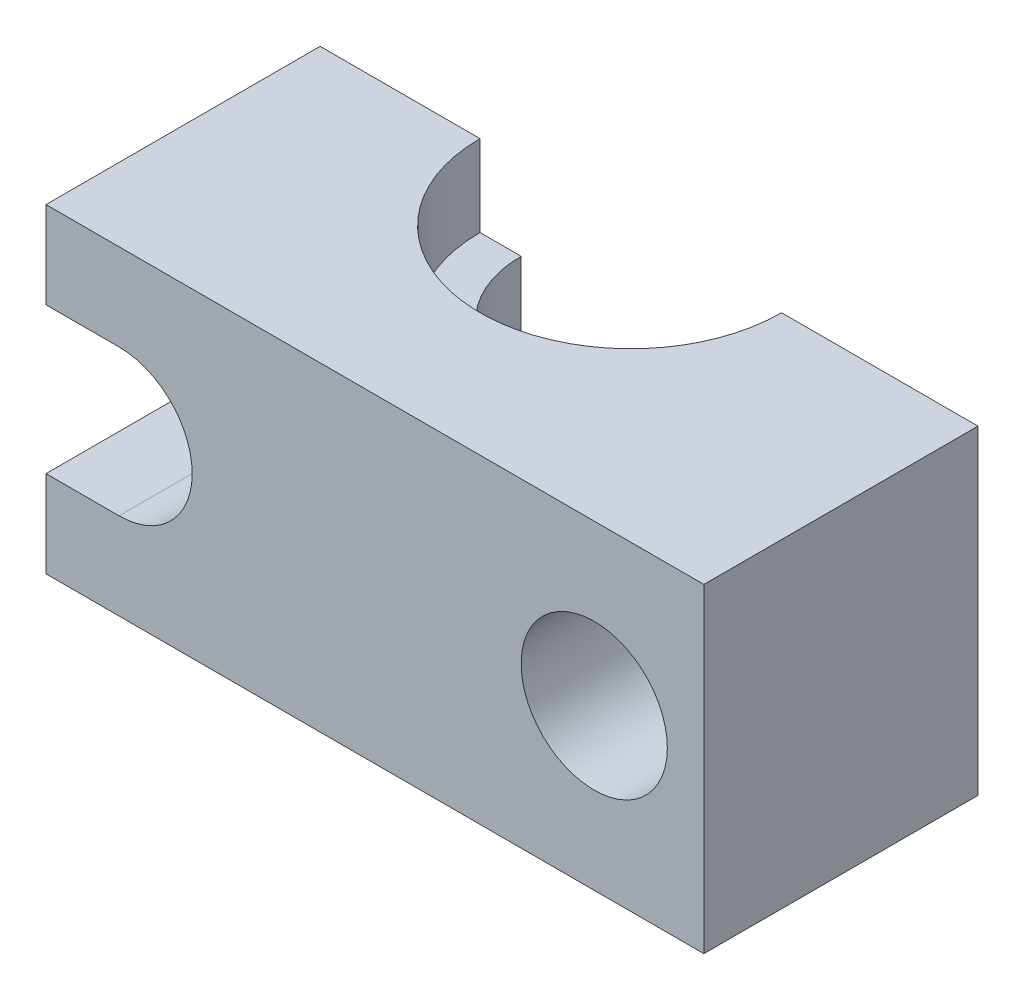
ISO-10303-21;
HEADER;
FILE_DESCRIPTION(('STEP AP214'),'2;1');
FILE_NAME('part.step','',(''),(''),'','','');
FILE_SCHEMA(('AUTOMOTIVE_DESIGN { 1 0 10303 214 1 1 1 1 }'));
ENDSEC;
DATA;
#1=APPLICATION_CONTEXT('core data for automotive mechanical design processes');
#2=APPLICATION_PROTOCOL_DEFINITION('international standard','automotive_design',2000,#1);
#3=PRODUCT_CONTEXT('',#1,'mechanical');
#4=PRODUCT('Part','Part','',(#3));
#5=PRODUCT_RELATED_PRODUCT_CATEGORY('part','',(#4));
#6=PRODUCT_DEFINITION_FORMATION('','',#4);
#7=PRODUCT_DEFINITION_CONTEXT('part definition',#1,'design');
#8=PRODUCT_DEFINITION('design','',#6,#7);
#9=PRODUCT_DEFINITION_SHAPE('','',#8);
#10=(LENGTH_UNIT() NAMED_UNIT(*) SI_UNIT(.MILLI.,.METRE.));
#11=(NAMED_UNIT(*) PLANE_ANGLE_UNIT() SI_UNIT($,.RADIAN.));
#12=(NAMED_UNIT(*) SI_UNIT($,.STERADIAN.) SOLID_ANGLE_UNIT());
#13=UNCERTAINTY_MEASURE_WITH_UNIT(LENGTH_MEASURE(1.E-05),#10,'distance_accuracy_value','');
#14=(GEOMETRIC_REPRESENTATION_CONTEXT(3) GLOBAL_UNCERTAINTY_ASSIGNED_CONTEXT((#13)) GLOBAL_UNIT_ASSIGNED_CONTEXT((#10,
#11,#12)) REPRESENTATION_CONTEXT('',''));
#15=CARTESIAN_POINT('',(0.,0.,0.));
#16=DIRECTION('',(0.,0.,1.));
#17=DIRECTION('',(1.,0.,0.));
#18=AXIS2_PLACEMENT_3D('',#15,#16,#17);
#19=CARTESIAN_POINT('',(0.,0.,0.));
#20=DIRECTION('',(0.,0.,1.));
#21=DIRECTION('',(1.,0.,0.));
#22=AXIS2_PLACEMENT_3D('',#19,#20,#21);
#23=PLANE('',#22);
#24=CARTESIAN_POINT('',(24.8485223656406,25.293010486401,0.));
#25=DIRECTION('',(0.,0.,1.));
#26=DIRECTION('',(1.,0.,0.));
#27=AXIS2_PLACEMENT_3D('',#24,#25,#26);
#28=CIRCLE('',#27,1.75);
#29=CARTESIAN_POINT('',(26.5985223656406,25.293010486401,0.));
#30=VERTEX_POINT('',#29);
#31=EDGE_CURVE('E193',#30,#30,#28,.F.);
#32=ORIENTED_EDGE('',*,*,#31,.F.);
#33=EDGE_LOOP('',(#32));
#34=FACE_BOUND('',#33,.T.);
#35=DIRECTION('',(-1.,0.,0.));
#36=VECTOR('',#35,1.);
#37=CARTESIAN_POINT('',(20.8485223656406,34.043010486401,0.));
#38=LINE('',#37,#36);
#39=CARTESIAN_POINT('',(29.5985223656406,34.043010486401,0.));
#40=VERTEX_POINT('',#39);
#41=CARTESIAN_POINT('',(20.8485223656406,34.043010486401,0.));
#42=VERTEX_POINT('',#41);
#43=EDGE_CURVE('E209',#40,#42,#38,.T.);
#44=ORIENTED_EDGE('',*,*,#43,.F.);
#45=DIRECTION('',(0.,-1.,0.));
#46=VECTOR('',#45,1.);
#47=CARTESIAN_POINT('',(29.5985223656406,16.543010486401,0.));
#48=LINE('',#47,#46);
#49=CARTESIAN_POINT('',(29.5985223656406,29.593010486401,0.));
#50=VERTEX_POINT('',#49);
#51=EDGE_CURVE('E12',#40,#50,#48,.T.);
#52=ORIENTED_EDGE('',*,*,#51,.T.);
#53=DIRECTION('',(1.,0.,0.));
#54=VECTOR('',#53,1.);
#55=CARTESIAN_POINT('',(0.,29.593010486401,0.));
#56=LINE('',#55,#54);
#57=CARTESIAN_POINT('',(31.8485223656406,29.593010486401,0.));
#58=VERTEX_POINT('',#57);
#59=EDGE_CURVE('E43',#50,#58,#56,.T.);
#60=ORIENTED_EDGE('',*,*,#59,.T.);
#61=DIRECTION('',(0.,-1.,0.));
#62=VECTOR('',#61,1.);
#63=CARTESIAN_POINT('',(31.8485223656406,16.543010486401,0.));
#64=LINE('',#63,#62);
#65=CARTESIAN_POINT('',(31.8485223656406,24.993010486401,0.));
#66=VERTEX_POINT('',#65);
#67=EDGE_CURVE('E287',#58,#66,#64,.T.);
#68=ORIENTED_EDGE('',*,*,#67,.T.);
#69=DIRECTION('',(-1.,0.,0.));
#70=VECTOR('',#69,1.);
#71=CARTESIAN_POINT('',(0.,24.993010486401,0.));
#72=LINE('',#71,#70);
#73=CARTESIAN_POINT('',(29.5985223656406,24.993010486401,0.));
#74=VERTEX_POINT('',#73);
#75=EDGE_CURVE('E171',#66,#74,#72,.T.);
#76=ORIENTED_EDGE('',*,*,#75,.T.);
#77=DIRECTION('',(0.,-1.,0.));
#78=VECTOR('',#77,1.);
#79=CARTESIAN_POINT('',(29.5985223656406,16.543010486401,0.));
#80=LINE('',#79,#78);
#81=CARTESIAN_POINT('',(29.5985223656406,21.993010486401,0.));
#82=VERTEX_POINT('',#81);
#83=EDGE_CURVE('E169',#74,#82,#80,.T.);
#84=ORIENTED_EDGE('',*,*,#83,.T.);
#85=DIRECTION('',(1.,0.,0.));
#86=VECTOR('',#85,1.);
#87=CARTESIAN_POINT('',(0.,21.993010486401,0.));
#88=LINE('',#87,#86);
#89=CARTESIAN_POINT('',(31.8485223656406,21.993010486401,0.));
#90=VERTEX_POINT('',#89);
#91=EDGE_CURVE('E154',#82,#90,#88,.T.);
#92=ORIENTED_EDGE('',*,*,#91,.T.);
#93=DIRECTION('',(0.,-1.,0.));
#94=VECTOR('',#93,1.);
#95=CARTESIAN_POINT('',(31.8485223656406,16.543010486401,0.));
#96=LINE('',#95,#94);
#97=CARTESIAN_POINT('',(31.8485223656406,16.543010486401,0.));
#98=VERTEX_POINT('',#97);
#99=EDGE_CURVE('E147',#90,#98,#96,.T.);
#100=ORIENTED_EDGE('',*,*,#99,.T.);
#101=DIRECTION('',(1.,0.,0.));
#102=VECTOR('',#101,1.);
#103=CARTESIAN_POINT('',(20.8485223656406,16.543010486401,0.));
#104=LINE('',#103,#102);
#105=CARTESIAN_POINT('',(20.8485223656406,16.543010486401,0.));
#106=VERTEX_POINT('',#105);
#107=EDGE_CURVE('E212',#106,#98,#104,.T.);
#108=ORIENTED_EDGE('',*,*,#107,.F.);
#109=DIRECTION('',(0.,-1.,0.));
#110=VECTOR('',#109,1.);
#111=CARTESIAN_POINT('',(20.8485223656406,34.043010486401,0.));
#112=LINE('',#111,#110);
#113=EDGE_CURVE('E215',#42,#106,#112,.T.);
#114=ORIENTED_EDGE('',*,*,#113,.F.);
#115=EDGE_LOOP('',(#44,#52,#60,#68,#76,#84,#92,#100,#108,#114));
#116=FACE_BOUND('',#115,.T.);
#117=ADVANCED_FACE('F35',(#34,#116),#23,.F.);
#118=CARTESIAN_POINT('',(24.8485223656406,25.293010486401,-4.94974746830585));
#119=DIRECTION('',(0.,0.,1.));
#120=DIRECTION('',(1.,0.,0.));
#121=AXIS2_PLACEMENT_3D('',#118,#119,#120);
#122=CYLINDRICAL_SURFACE('',#121,1.75);
#123=CARTESIAN_POINT('',(24.8485223656406,25.293010486401,4.));
#124=DIRECTION('',(0.,0.,1.));
#125=DIRECTION('',(1.,0.,0.));
#126=AXIS2_PLACEMENT_3D('',#123,#124,#125);
#127=CIRCLE('',#126,1.75);
#128=CARTESIAN_POINT('',(26.5985223656406,25.293010486401,4.));
#129=VERTEX_POINT('',#128);
#130=EDGE_CURVE('E186',#129,#129,#127,.F.);
#131=CARTESIAN_POINT('',(26.5985223656406,25.293010486401,0.));
#132=CARTESIAN_POINT('',(26.5985223656406,25.293010486401,0.0416666666666658));
#133=CARTESIAN_POINT('',(26.5985223656406,25.293010486401,0.0833333333333325));
#134=CARTESIAN_POINT('',(26.5985223656406,25.293010486401,0.166666666666666));
#135=CARTESIAN_POINT('',(26.5985223656406,25.293010486401,0.208333333333333));
#136=CARTESIAN_POINT('',(26.5985223656406,25.293010486401,0.291666666666666));
#137=CARTESIAN_POINT('',(26.5985223656406,25.293010486401,0.333333333333333));
#138=CARTESIAN_POINT('',(26.5985223656406,25.293010486401,0.416666666666666));
#139=CARTESIAN_POINT('',(26.5985223656406,25.293010486401,0.458333333333333));
#140=CARTESIAN_POINT('',(26.5985223656406,25.293010486401,0.541666666666666));
#141=CARTESIAN_POINT('',(26.5985223656406,25.293010486401,0.583333333333332));
#142=CARTESIAN_POINT('',(26.5985223656406,25.293010486401,0.666666666666666));
#143=CARTESIAN_POINT('',(26.5985223656406,25.293010486401,0.708333333333332));
#144=CARTESIAN_POINT('',(26.5985223656406,25.293010486401,0.791666666666666));
#145=CARTESIAN_POINT('',(26.5985223656406,25.293010486401,0.833333333333332));
#146=CARTESIAN_POINT('',(26.5985223656406,25.293010486401,0.916666666666666));
#147=CARTESIAN_POINT('',(26.5985223656406,25.293010486401,0.958333333333332));
#148=CARTESIAN_POINT('',(26.5985223656406,25.293010486401,1.04166666666667));
#149=CARTESIAN_POINT('',(26.5985223656406,25.293010486401,1.08333333333333));
#150=CARTESIAN_POINT('',(26.5985223656406,25.293010486401,1.16666666666667));
#151=CARTESIAN_POINT('',(26.5985223656406,25.293010486401,1.20833333333333));
#152=CARTESIAN_POINT('',(26.5985223656406,25.293010486401,1.29166666666667));
#153=CARTESIAN_POINT('',(26.5985223656406,25.293010486401,1.33333333333333));
#154=CARTESIAN_POINT('',(26.5985223656406,25.293010486401,1.41666666666667));
#155=CARTESIAN_POINT('',(26.5985223656406,25.293010486401,1.45833333333333));
#156=CARTESIAN_POINT('',(26.5985223656406,25.293010486401,1.54166666666667));
#157=CARTESIAN_POINT('',(26.5985223656406,25.293010486401,1.58333333333333));
#158=CARTESIAN_POINT('',(26.5985223656406,25.293010486401,1.66666666666667));
#159=CARTESIAN_POINT('',(26.5985223656406,25.293010486401,1.70833333333333));
#160=CARTESIAN_POINT('',(26.5985223656406,25.293010486401,1.79166666666667));
#161=CARTESIAN_POINT('',(26.5985223656406,25.293010486401,1.83333333333333));
#162=CARTESIAN_POINT('',(26.5985223656406,25.293010486401,1.91666666666667));
#163=CARTESIAN_POINT('',(26.5985223656406,25.293010486401,1.95833333333333));
#164=CARTESIAN_POINT('',(26.5985223656406,25.293010486401,2.04166666666667));
#165=CARTESIAN_POINT('',(26.5985223656406,25.293010486401,2.08333333333333));
#166=CARTESIAN_POINT('',(26.5985223656406,25.293010486401,2.16666666666667));
#167=CARTESIAN_POINT('',(26.5985223656406,25.293010486401,2.20833333333333));
#168=CARTESIAN_POINT('',(26.5985223656406,25.293010486401,2.29166666666667));
#169=CARTESIAN_POINT('',(26.5985223656406,25.293010486401,2.33333333333333));
#170=CARTESIAN_POINT('',(26.5985223656406,25.293010486401,2.41666666666667));
#171=CARTESIAN_POINT('',(26.5985223656406,25.293010486401,2.45833333333333));
#172=CARTESIAN_POINT('',(26.5985223656406,25.293010486401,2.54166666666667));
#173=CARTESIAN_POINT('',(26.5985223656406,25.293010486401,2.58333333333333));
#174=CARTESIAN_POINT('',(26.5985223656406,25.293010486401,2.66666666666667));
#175=CARTESIAN_POINT('',(26.5985223656406,25.293010486401,2.70833333333333));
#176=CARTESIAN_POINT('',(26.5985223656406,25.293010486401,2.79166666666666));
#177=CARTESIAN_POINT('',(26.5985223656406,25.293010486401,2.83333333333333));
#178=CARTESIAN_POINT('',(26.5985223656406,25.293010486401,2.91666666666666));
#179=CARTESIAN_POINT('',(26.5985223656406,25.293010486401,2.95833333333333));
#180=CARTESIAN_POINT('',(26.5985223656406,25.293010486401,3.04166666666666));
#181=CARTESIAN_POINT('',(26.5985223656406,25.293010486401,3.08333333333333));
#182=CARTESIAN_POINT('',(26.5985223656406,25.293010486401,3.16666666666666));
#183=CARTESIAN_POINT('',(26.5985223656406,25.293010486401,3.20833333333333));
#184=CARTESIAN_POINT('',(26.5985223656406,25.293010486401,3.29166666666666));
#185=CARTESIAN_POINT('',(26.5985223656406,25.293010486401,3.33333333333333));
#186=CARTESIAN_POINT('',(26.5985223656406,25.293010486401,3.41666666666666));
#187=CARTESIAN_POINT('',(26.5985223656406,25.293010486401,3.45833333333333));
#188=CARTESIAN_POINT('',(26.5985223656406,25.293010486401,3.54166666666666));
#189=CARTESIAN_POINT('',(26.5985223656406,25.293010486401,3.58333333333333));
#190=CARTESIAN_POINT('',(26.5985223656406,25.293010486401,3.66666666666666));
#191=CARTESIAN_POINT('',(26.5985223656406,25.293010486401,3.70833333333333));
#192=CARTESIAN_POINT('',(26.5985223656406,25.293010486401,3.79166666666667));
#193=CARTESIAN_POINT('',(26.5985223656406,25.293010486401,3.83333333333333));
#194=CARTESIAN_POINT('',(26.5985223656406,25.293010486401,3.91666666666666));
#195=CARTESIAN_POINT('',(26.5985223656406,25.293010486401,3.95833333333333));
#196=CARTESIAN_POINT('',(26.5985223656406,25.293010486401,4.));
#197=B_SPLINE_CURVE_WITH_KNOTS('',3,(#131,#132,#133,#134,#135,#136,#137,#138,#139,#140,#141,
#142,#143,#144,#145,#146,#147,#148,#149,#150,#151,#152,#153,#154,#155,#156,#157,#158,#159,#160,
#161,#162,#163,#164,#165,#166,#167,#168,#169,#170,#171,#172,#173,#174,#175,#176,#177,#178,#179,
#180,#181,#182,#183,#184,#185,#186,#187,#188,#189,#190,#191,#192,#193,#194,#195,#196),
.UNSPECIFIED.,.F.,.F.,(4,2,2,2,2,2,2,2,2,2,2,2,2,2,2,2,2,2,2,2,2,2,2,2,2,2,2,2,2,2,2,2,4),(0.,
0.125,0.25,0.375,0.5,0.625,0.75,0.875,1.,1.125,1.25,1.375,1.5,1.625,1.75,1.875,2.,2.125,2.25,
2.375,2.5,2.625,2.75,2.875,3.,3.125,3.25,3.375,3.5,3.625,3.75,3.875,4.),.UNSPECIFIED.);
#198=EDGE_CURVE('BSEAM310',#30,#129,#197,.T.);
#199=ORIENTED_EDGE('',*,*,#31,.T.);
#200=ORIENTED_EDGE('',*,*,#130,.F.);
#201=ORIENTED_EDGE('',*,*,#198,.T.);
#202=ORIENTED_EDGE('',*,*,#198,.F.);
#203=EDGE_LOOP('',(#199,#201,#200,#202));
#204=FACE_BOUND('',#203,.T.);
#205=ADVANCED_FACE('F310',(#204),#122,.F.);
#206=CARTESIAN_POINT('',(50.8485223656406,25.293010486401,-4.94974746830585));
#207=DIRECTION('',(0.,0.,1.));
#208=DIRECTION('',(1.,0.,0.));
#209=AXIS2_PLACEMENT_3D('',#206,#207,#208);
#210=CYLINDRICAL_SURFACE('',#209,1.75);
#211=CARTESIAN_POINT('',(50.8485223656406,25.293010486401,0.));
#212=DIRECTION('',(0.,0.,1.));
#213=DIRECTION('',(1.,0.,0.));
#214=AXIS2_PLACEMENT_3D('',#211,#212,#213);
#215=CIRCLE('',#214,1.75);
#216=CARTESIAN_POINT('',(52.5985223656406,25.293010486401,0.));
#217=VERTEX_POINT('',#216);
#218=EDGE_CURVE('E218',#217,#217,#215,.F.);
#219=CARTESIAN_POINT('',(50.8485223656406,25.293010486401,4.));
#220=DIRECTION('',(0.,0.,1.));
#221=DIRECTION('',(1.,0.,0.));
#222=AXIS2_PLACEMENT_3D('',#219,#220,#221);
#223=CIRCLE('',#222,1.75);
#224=CARTESIAN_POINT('',(52.5985223656406,25.293010486401,4.));
#225=VERTEX_POINT('',#224);
#226=EDGE_CURVE('E191',#225,#225,#223,.F.);
#227=CARTESIAN_POINT('',(52.5985223656406,25.293010486401,0.));
#228=CARTESIAN_POINT('',(52.5985223656406,25.293010486401,0.0416666666666658));
#229=CARTESIAN_POINT('',(52.5985223656406,25.293010486401,0.0833333333333325));
#230=CARTESIAN_POINT('',(52.5985223656406,25.293010486401,0.166666666666666));
#231=CARTESIAN_POINT('',(52.5985223656406,25.293010486401,0.208333333333333));
#232=CARTESIAN_POINT('',(52.5985223656406,25.293010486401,0.291666666666666));
#233=CARTESIAN_POINT('',(52.5985223656406,25.293010486401,0.333333333333333));
#234=CARTESIAN_POINT('',(52.5985223656406,25.293010486401,0.416666666666666));
#235=CARTESIAN_POINT('',(52.5985223656406,25.293010486401,0.458333333333333));
#236=CARTESIAN_POINT('',(52.5985223656406,25.293010486401,0.541666666666666));
#237=CARTESIAN_POINT('',(52.5985223656406,25.293010486401,0.583333333333332));
#238=CARTESIAN_POINT('',(52.5985223656406,25.293010486401,0.666666666666666));
#239=CARTESIAN_POINT('',(52.5985223656406,25.293010486401,0.708333333333332));
#240=CARTESIAN_POINT('',(52.5985223656406,25.293010486401,0.791666666666666));
#241=CARTESIAN_POINT('',(52.5985223656406,25.293010486401,0.833333333333332));
#242=CARTESIAN_POINT('',(52.5985223656406,25.293010486401,0.916666666666666));
#243=CARTESIAN_POINT('',(52.5985223656406,25.293010486401,0.958333333333332));
#244=CARTESIAN_POINT('',(52.5985223656406,25.293010486401,1.04166666666667));
#245=CARTESIAN_POINT('',(52.5985223656406,25.293010486401,1.08333333333333));
#246=CARTESIAN_POINT('',(52.5985223656406,25.293010486401,1.16666666666667));
#247=CARTESIAN_POINT('',(52.5985223656406,25.293010486401,1.20833333333333));
#248=CARTESIAN_POINT('',(52.5985223656406,25.293010486401,1.29166666666667));
#249=CARTESIAN_POINT('',(52.5985223656406,25.293010486401,1.33333333333333));
#250=CARTESIAN_POINT('',(52.5985223656406,25.293010486401,1.41666666666667));
#251=CARTESIAN_POINT('',(52.5985223656406,25.293010486401,1.45833333333333));
#252=CARTESIAN_POINT('',(52.5985223656406,25.293010486401,1.54166666666667));
#253=CARTESIAN_POINT('',(52.5985223656406,25.293010486401,1.58333333333333));
#254=CARTESIAN_POINT('',(52.5985223656406,25.293010486401,1.66666666666667));
#255=CARTESIAN_POINT('',(52.5985223656406,25.293010486401,1.70833333333333));
#256=CARTESIAN_POINT('',(52.5985223656406,25.293010486401,1.79166666666667));
#257=CARTESIAN_POINT('',(52.5985223656406,25.293010486401,1.83333333333333));
#258=CARTESIAN_POINT('',(52.5985223656406,25.293010486401,1.91666666666667));
#259=CARTESIAN_POINT('',(52.5985223656406,25.293010486401,1.95833333333333));
#260=CARTESIAN_POINT('',(52.5985223656406,25.293010486401,2.04166666666667));
#261=CARTESIAN_POINT('',(52.5985223656406,25.293010486401,2.08333333333333));
#262=CARTESIAN_POINT('',(52.5985223656406,25.293010486401,2.16666666666667));
#263=CARTESIAN_POINT('',(52.5985223656406,25.293010486401,2.20833333333333));
#264=CARTESIAN_POINT('',(52.5985223656406,25.293010486401,2.29166666666667));
#265=CARTESIAN_POINT('',(52.5985223656406,25.293010486401,2.33333333333333));
#266=CARTESIAN_POINT('',(52.5985223656406,25.293010486401,2.41666666666667));
#267=CARTESIAN_POINT('',(52.5985223656406,25.293010486401,2.45833333333333));
#268=CARTESIAN_POINT('',(52.5985223656406,25.293010486401,2.54166666666667));
#269=CARTESIAN_POINT('',(52.5985223656406,25.293010486401,2.58333333333333));
#270=CARTESIAN_POINT('',(52.5985223656406,25.293010486401,2.66666666666667));
#271=CARTESIAN_POINT('',(52.5985223656406,25.293010486401,2.70833333333333));
#272=CARTESIAN_POINT('',(52.5985223656406,25.293010486401,2.79166666666666));
#273=CARTESIAN_POINT('',(52.5985223656406,25.293010486401,2.83333333333333));
#274=CARTESIAN_POINT('',(52.5985223656406,25.293010486401,2.91666666666666));
#275=CARTESIAN_POINT('',(52.5985223656406,25.293010486401,2.95833333333333));
#276=CARTESIAN_POINT('',(52.5985223656406,25.293010486401,3.04166666666666));
#277=CARTESIAN_POINT('',(52.5985223656406,25.293010486401,3.08333333333333));
#278=CARTESIAN_POINT('',(52.5985223656406,25.293010486401,3.16666666666666));
#279=CARTESIAN_POINT('',(52.5985223656406,25.293010486401,3.20833333333333));
#280=CARTESIAN_POINT('',(52.5985223656406,25.293010486401,3.29166666666666));
#281=CARTESIAN_POINT('',(52.5985223656406,25.293010486401,3.33333333333333));
#282=CARTESIAN_POINT('',(52.5985223656406,25.293010486401,3.41666666666666));
#283=CARTESIAN_POINT('',(52.5985223656406,25.293010486401,3.45833333333333));
#284=CARTESIAN_POINT('',(52.5985223656406,25.293010486401,3.54166666666666));
#285=CARTESIAN_POINT('',(52.5985223656406,25.293010486401,3.58333333333333));
#286=CARTESIAN_POINT('',(52.5985223656406,25.293010486401,3.66666666666666));
#287=CARTESIAN_POINT('',(52.5985223656406,25.293010486401,3.70833333333333));
#288=CARTESIAN_POINT('',(52.5985223656406,25.293010486401,3.79166666666667));
#289=CARTESIAN_POINT('',(52.5985223656406,25.293010486401,3.83333333333333));
#290=CARTESIAN_POINT('',(52.5985223656406,25.293010486401,3.91666666666666));
#291=CARTESIAN_POINT('',(52.5985223656406,25.293010486401,3.95833333333333));
#292=CARTESIAN_POINT('',(52.5985223656406,25.293010486401,4.));
#293=B_SPLINE_CURVE_WITH_KNOTS('',3,(#227,#228,#229,#230,#231,#232,#233,#234,#235,#236,#237,
#238,#239,#240,#241,#242,#243,#244,#245,#246,#247,#248,#249,#250,#251,#252,#253,#254,#255,#256,
#257,#258,#259,#260,#261,#262,#263,#264,#265,#266,#267,#268,#269,#270,#271,#272,#273,#274,#275,
#276,#277,#278,#279,#280,#281,#282,#283,#284,#285,#286,#287,#288,#289,#290,#291,#292),
.UNSPECIFIED.,.F.,.F.,(4,2,2,2,2,2,2,2,2,2,2,2,2,2,2,2,2,2,2,2,2,2,2,2,2,2,2,2,2,2,2,2,4),(0.,
0.125,0.25,0.375,0.5,0.625,0.75,0.875,1.,1.125,1.25,1.375,1.5,1.625,1.75,1.875,2.,2.125,2.25,
2.375,2.5,2.625,2.75,2.875,3.,3.125,3.25,3.375,3.5,3.625,3.75,3.875,4.),.UNSPECIFIED.);
#294=EDGE_CURVE('BSEAM316',#217,#225,#293,.T.);
#295=ORIENTED_EDGE('',*,*,#218,.T.);
#296=ORIENTED_EDGE('',*,*,#226,.F.);
#297=ORIENTED_EDGE('',*,*,#294,.T.);
#298=ORIENTED_EDGE('',*,*,#294,.F.);
#299=EDGE_LOOP('',(#295,#297,#296,#298));
#300=FACE_BOUND('',#299,.T.);
#301=ADVANCED_FACE('F316',(#300),#210,.F.);
#302=CARTESIAN_POINT('',(20.8485223656406,34.043010486401,15.));
#303=DIRECTION('',(1.,0.,0.));
#304=DIRECTION('',(0.,1.,0.));
#305=AXIS2_PLACEMENT_3D('',#302,#303,#304);
#306=PLANE('',#305);
#307=DIRECTION('',(0.,-1.,0.));
#308=VECTOR('',#307,1.);
#309=CARTESIAN_POINT('',(20.8485223656406,34.043010486401,15.));
#310=LINE('',#309,#308);
#311=CARTESIAN_POINT('',(20.8485223656406,21.293010486401,15.));
#312=VERTEX_POINT('',#311);
#313=CARTESIAN_POINT('',(20.8485223656406,16.543010486401,15.));
#314=VERTEX_POINT('',#313);
#315=EDGE_CURVE('E208',#312,#314,#310,.T.);
#316=ORIENTED_EDGE('',*,*,#315,.F.);
#317=DIRECTION('',(0.,0.,1.));
#318=VECTOR('',#317,1.);
#319=CARTESIAN_POINT('',(20.8485223656406,21.293010486401,-11.3137084989848));
#320=LINE('',#319,#318);
#321=CARTESIAN_POINT('',(20.8485223656406,21.293010486401,4.));
#322=VERTEX_POINT('',#321);
#323=EDGE_CURVE('E243',#322,#312,#320,.T.);
#324=ORIENTED_EDGE('',*,*,#323,.F.);
#325=DIRECTION('',(0.,1.,0.));
#326=VECTOR('',#325,1.);
#327=CARTESIAN_POINT('',(20.8485223656406,29.293010486401,4.));
#328=LINE('',#327,#326);
#329=CARTESIAN_POINT('',(20.8485223656406,29.293010486401,4.));
#330=VERTEX_POINT('',#329);
#331=EDGE_CURVE('E247',#322,#330,#328,.T.);
#332=ORIENTED_EDGE('',*,*,#331,.T.);
#333=DIRECTION('',(0.,0.,1.));
#334=VECTOR('',#333,1.);
#335=CARTESIAN_POINT('',(20.8485223656406,29.293010486401,-11.3137084989848));
#336=LINE('',#335,#334);
#337=CARTESIAN_POINT('',(20.8485223656406,29.293010486401,15.));
#338=VERTEX_POINT('',#337);
#339=EDGE_CURVE('E239',#330,#338,#336,.T.);
#340=ORIENTED_EDGE('',*,*,#339,.T.);
#341=CARTESIAN_POINT('',(20.8485223656406,34.043010486401,15.));
#342=VERTEX_POINT('',#341);
#343=EDGE_CURVE('E224',#342,#338,#310,.T.);
#344=ORIENTED_EDGE('',*,*,#343,.F.);
#345=DIRECTION('',(0.,0.,-1.));
#346=VECTOR('',#345,1.);
#347=CARTESIAN_POINT('',(20.8485223656406,34.043010486401,15.));
#348=LINE('',#347,#346);
#349=EDGE_CURVE('E201',#342,#42,#348,.T.);
#350=ORIENTED_EDGE('',*,*,#349,.T.);
#351=ORIENTED_EDGE('',*,*,#113,.T.);
#352=DIRECTION('',(0.,0.,-1.));
#353=VECTOR('',#352,1.);
#354=CARTESIAN_POINT('',(20.8485223656406,16.543010486401,15.));
#355=LINE('',#354,#353);
#356=EDGE_CURVE('E180',#314,#106,#355,.T.);
#357=ORIENTED_EDGE('',*,*,#356,.F.);
#358=EDGE_LOOP('',(#316,#324,#332,#340,#344,#350,#351,#357));
#359=FACE_BOUND('',#358,.T.);
#360=ADVANCED_FACE('F37',(#359),#306,.F.);
#361=CARTESIAN_POINT('',(20.8485223656406,16.543010486401,15.));
#362=DIRECTION('',(0.,1.,0.));
#363=DIRECTION('',(0.,0.,1.));
#364=AXIS2_PLACEMENT_3D('',#361,#362,#363);
#365=PLANE('',#364);
#366=ORIENTED_EDGE('',*,*,#107,.T.);
#367=CARTESIAN_POINT('',(37.8485223656406,16.543010486401,0.));
#368=DIRECTION('',(0.,-1.,0.));
#369=DIRECTION('',(0.,0.,-1.));
#370=AXIS2_PLACEMENT_3D('',#367,#368,#369);
#371=CIRCLE('',#370,6.);
#372=CARTESIAN_POINT('',(43.8485223656406,16.543010486401,0.));
#373=VERTEX_POINT('',#372);
#374=EDGE_CURVE('E150',#373,#98,#371,.T.);
#375=ORIENTED_EDGE('',*,*,#374,.F.);
#376=CARTESIAN_POINT('',(56.8485223656406,16.543010486401,0.));
#377=VERTEX_POINT('',#376);
#378=EDGE_CURVE('E214',#373,#377,#104,.T.);
#379=ORIENTED_EDGE('',*,*,#378,.T.);
#380=DIRECTION('',(0.,0.,-1.));
#381=VECTOR('',#380,1.);
#382=CARTESIAN_POINT('',(56.8485223656406,16.543010486401,15.));
#383=LINE('',#382,#381);
#384=CARTESIAN_POINT('',(56.8485223656406,16.543010486401,15.));
#385=VERTEX_POINT('',#384);
#386=EDGE_CURVE('E183',#385,#377,#383,.T.);
#387=ORIENTED_EDGE('',*,*,#386,.F.);
#388=DIRECTION('',(1.,0.,0.));
#389=VECTOR('',#388,1.);
#390=CARTESIAN_POINT('',(20.8485223656406,16.543010486401,15.));
#391=LINE('',#390,#389);
#392=EDGE_CURVE('E222',#314,#385,#391,.T.);
#393=ORIENTED_EDGE('',*,*,#392,.F.);
#394=ORIENTED_EDGE('',*,*,#356,.T.);
#395=EDGE_LOOP('',(#366,#375,#379,#387,#393,#394));
#396=FACE_BOUND('',#395,.T.);
#397=ADVANCED_FACE('F345',(#396),#365,.F.);
#398=CARTESIAN_POINT('',(56.8485223656406,34.043010486401,15.));
#399=DIRECTION('',(-1.,0.,0.));
#400=DIRECTION('',(0.,0.,1.));
#401=AXIS2_PLACEMENT_3D('',#398,#399,#400);
#402=PLANE('',#401);
#403=DIRECTION('',(0.,1.,0.));
#404=VECTOR('',#403,1.);
#405=CARTESIAN_POINT('',(56.8485223656406,34.043010486401,0.));
#406=LINE('',#405,#404);
#407=CARTESIAN_POINT('',(56.8485223656406,34.043010486401,0.));
#408=VERTEX_POINT('',#407);
#409=EDGE_CURVE('E210',#377,#408,#406,.T.);
#410=ORIENTED_EDGE('',*,*,#409,.T.);
#411=DIRECTION('',(0.,0.,-1.));
#412=VECTOR('',#411,1.);
#413=CARTESIAN_POINT('',(56.8485223656406,34.043010486401,15.));
#414=LINE('',#413,#412);
#415=CARTESIAN_POINT('',(56.8485223656406,34.043010486401,15.));
#416=VERTEX_POINT('',#415);
#417=EDGE_CURVE('E198',#416,#408,#414,.T.);
#418=ORIENTED_EDGE('',*,*,#417,.F.);
#419=DIRECTION('',(0.,1.,0.));
#420=VECTOR('',#419,1.);
#421=CARTESIAN_POINT('',(56.8485223656406,34.043010486401,15.));
#422=LINE('',#421,#420);
#423=EDGE_CURVE('E220',#385,#416,#422,.T.);
#424=ORIENTED_EDGE('',*,*,#423,.F.);
#425=ORIENTED_EDGE('',*,*,#386,.T.);
#426=EDGE_LOOP('',(#410,#418,#424,#425));
#427=FACE_BOUND('',#426,.T.);
#428=ADVANCED_FACE('F476',(#427),#402,.F.);
#429=CARTESIAN_POINT('',(20.8485223656406,34.043010486401,15.));
#430=DIRECTION('',(0.,-1.,0.));
#431=DIRECTION('',(0.,0.,-1.));
#432=AXIS2_PLACEMENT_3D('',#429,#430,#431);
#433=PLANE('',#432);
#434=CARTESIAN_POINT('',(46.0985223656406,34.043010486401,0.));
#435=VERTEX_POINT('',#434);
#436=EDGE_CURVE('E205',#408,#435,#38,.T.);
#437=ORIENTED_EDGE('',*,*,#436,.T.);
#438=CARTESIAN_POINT('',(37.8485223656406,34.043010486401,0.));
#439=DIRECTION('',(0.,-1.,0.));
#440=DIRECTION('',(0.,0.,-1.));
#441=AXIS2_PLACEMENT_3D('',#438,#439,#440);
#442=CIRCLE('',#441,8.25);
#443=EDGE_CURVE('E253',#435,#40,#442,.T.);
#444=ORIENTED_EDGE('',*,*,#443,.T.);
#445=ORIENTED_EDGE('',*,*,#43,.T.);
#446=ORIENTED_EDGE('',*,*,#349,.F.);
#447=DIRECTION('',(-1.,0.,0.));
#448=VECTOR('',#447,1.);
#449=CARTESIAN_POINT('',(20.8485223656406,34.043010486401,15.));
#450=LINE('',#449,#448);
#451=EDGE_CURVE('E204',#416,#342,#450,.T.);
#452=ORIENTED_EDGE('',*,*,#451,.F.);
#453=ORIENTED_EDGE('',*,*,#417,.T.);
#454=EDGE_LOOP('',(#437,#444,#445,#446,#452,#453));
#455=FACE_BOUND('',#454,.T.);
#456=ADVANCED_FACE('F333',(#455),#433,.F.);
#457=CARTESIAN_POINT('',(0.,0.,15.));
#458=DIRECTION('',(0.,0.,1.));
#459=DIRECTION('',(1.,0.,0.));
#460=AXIS2_PLACEMENT_3D('',#457,#458,#459);
#461=PLANE('',#460);
#462=DIRECTION('',(1.,0.,0.));
#463=VECTOR('',#462,1.);
#464=CARTESIAN_POINT('',(20.8485223656406,21.293010486401,15.));
#465=LINE('',#464,#463);
#466=CARTESIAN_POINT('',(24.8485223656406,21.293010486401,15.));
#467=VERTEX_POINT('',#466);
#468=EDGE_CURVE('E240',#312,#467,#465,.T.);
#469=ORIENTED_EDGE('',*,*,#468,.F.);
#470=ORIENTED_EDGE('',*,*,#315,.T.);
#471=ORIENTED_EDGE('',*,*,#392,.T.);
#472=ORIENTED_EDGE('',*,*,#423,.T.);
#473=ORIENTED_EDGE('',*,*,#451,.T.);
#474=ORIENTED_EDGE('',*,*,#343,.T.);
#475=DIRECTION('',(-1.,0.,0.));
#476=VECTOR('',#475,1.);
#477=CARTESIAN_POINT('',(24.8485223656406,29.293010486401,15.));
#478=LINE('',#477,#476);
#479=CARTESIAN_POINT('',(24.8485223656406,29.293010486401,15.));
#480=VERTEX_POINT('',#479);
#481=EDGE_CURVE('E250',#480,#338,#478,.T.);
#482=ORIENTED_EDGE('',*,*,#481,.F.);
#483=CARTESIAN_POINT('',(24.8485223656406,25.293010486401,15.));
#484=DIRECTION('',(0.,0.,1.));
#485=DIRECTION('',(1.,0.,0.));
#486=AXIS2_PLACEMENT_3D('',#483,#484,#485);
#487=CIRCLE('',#486,4.);
#488=EDGE_CURVE('E58',#467,#480,#487,.T.);
#489=ORIENTED_EDGE('',*,*,#488,.F.);
#490=EDGE_LOOP('',(#469,#470,#471,#472,#473,#474,#482,#489));
#491=FACE_BOUND('',#490,.T.);
#492=CARTESIAN_POINT('',(50.8485223656406,25.293010486401,15.));
#493=DIRECTION('',(0.,0.,1.));
#494=DIRECTION('',(1.,0.,0.));
#495=AXIS2_PLACEMENT_3D('',#492,#493,#494);
#496=CIRCLE('',#495,4.);
#497=CARTESIAN_POINT('',(54.8485223656406,25.293010486401,15.));
#498=VERTEX_POINT('',#497);
#499=EDGE_CURVE('E189',#498,#498,#496,.T.);
#500=ORIENTED_EDGE('',*,*,#499,.F.);
#501=EDGE_LOOP('',(#500));
#502=FACE_BOUND('',#501,.T.);
#503=ADVANCED_FACE('F324',(#491,#502),#461,.T.);
#504=ORIENTED_EDGE('',*,*,#218,.F.);
#505=EDGE_LOOP('',(#504));
#506=FACE_BOUND('',#505,.T.);
#507=CARTESIAN_POINT('',(43.8485223656406,29.593010486401,0.));
#508=VERTEX_POINT('',#507);
#509=CARTESIAN_POINT('',(46.0985223656406,29.593010486401,0.));
#510=VERTEX_POINT('',#509);
#511=EDGE_CURVE('E285',#508,#510,#56,.T.);
#512=ORIENTED_EDGE('',*,*,#511,.T.);
#513=DIRECTION('',(0.,-1.,0.));
#514=VECTOR('',#513,1.);
#515=CARTESIAN_POINT('',(46.0985223656406,16.543010486401,0.));
#516=LINE('',#515,#514);
#517=EDGE_CURVE('E155',#510,#435,#516,.F.);
#518=ORIENTED_EDGE('',*,*,#517,.T.);
#519=ORIENTED_EDGE('',*,*,#436,.F.);
#520=ORIENTED_EDGE('',*,*,#409,.F.);
#521=ORIENTED_EDGE('',*,*,#378,.F.);
#522=DIRECTION('',(0.,-1.,0.));
#523=VECTOR('',#522,1.);
#524=CARTESIAN_POINT('',(43.8485223656406,16.543010486401,0.));
#525=LINE('',#524,#523);
#526=CARTESIAN_POINT('',(43.8485223656406,21.993010486401,0.));
#527=VERTEX_POINT('',#526);
#528=EDGE_CURVE('E176',#373,#527,#525,.F.);
#529=ORIENTED_EDGE('',*,*,#528,.T.);
#530=CARTESIAN_POINT('',(46.0985223656406,21.993010486401,0.));
#531=VERTEX_POINT('',#530);
#532=EDGE_CURVE('E162',#527,#531,#88,.T.);
#533=ORIENTED_EDGE('',*,*,#532,.T.);
#534=DIRECTION('',(0.,-1.,0.));
#535=VECTOR('',#534,1.);
#536=CARTESIAN_POINT('',(46.0985223656406,16.543010486401,0.));
#537=LINE('',#536,#535);
#538=CARTESIAN_POINT('',(46.0985223656406,24.993010486401,0.));
#539=VERTEX_POINT('',#538);
#540=EDGE_CURVE('E175',#531,#539,#537,.F.);
#541=ORIENTED_EDGE('',*,*,#540,.T.);
#542=CARTESIAN_POINT('',(43.8485223656406,24.993010486401,0.));
#543=VERTEX_POINT('',#542);
#544=EDGE_CURVE('E179',#539,#543,#72,.T.);
#545=ORIENTED_EDGE('',*,*,#544,.T.);
#546=DIRECTION('',(0.,-1.,0.));
#547=VECTOR('',#546,1.);
#548=CARTESIAN_POINT('',(43.8485223656406,16.543010486401,0.));
#549=LINE('',#548,#547);
#550=EDGE_CURVE('E281',#543,#508,#549,.F.);
#551=ORIENTED_EDGE('',*,*,#550,.T.);
#552=EDGE_LOOP('',(#512,#518,#519,#520,#521,#529,#533,#541,#545,#551));
#553=FACE_BOUND('',#552,.T.);
#554=ADVANCED_FACE('F279',(#506,#553),#23,.F.);
#555=CARTESIAN_POINT('',(0.,0.,4.));
#556=DIRECTION('',(0.,0.,1.));
#557=DIRECTION('',(1.,0.,0.));
#558=AXIS2_PLACEMENT_3D('',#555,#556,#557);
#559=PLANE('',#558);
#560=CARTESIAN_POINT('',(50.8485223656406,25.293010486401,4.));
#561=DIRECTION('',(0.,0.,1.));
#562=DIRECTION('',(1.,0.,0.));
#563=AXIS2_PLACEMENT_3D('',#560,#561,#562);
#564=CIRCLE('',#563,4.);
#565=CARTESIAN_POINT('',(54.8485223656406,25.293010486401,4.));
#566=VERTEX_POINT('',#565);
#567=EDGE_CURVE('E194',#566,#566,#564,.F.);
#568=ORIENTED_EDGE('',*,*,#567,.F.);
#569=EDGE_LOOP('',(#568));
#570=FACE_BOUND('',#569,.T.);
#571=ORIENTED_EDGE('',*,*,#226,.T.);
#572=EDGE_LOOP('',(#571));
#573=FACE_BOUND('',#572,.T.);
#574=ADVANCED_FACE('F323',(#570,#573),#559,.T.);
#575=CARTESIAN_POINT('',(50.8485223656406,25.293010486401,-11.3137084989848));
#576=DIRECTION('',(0.,0.,1.));
#577=DIRECTION('',(1.,0.,0.));
#578=AXIS2_PLACEMENT_3D('',#575,#576,#577);
#579=CYLINDRICAL_SURFACE('',#578,4.);
#580=ORIENTED_EDGE('',*,*,#567,.T.);
#581=EDGE_LOOP('',(#580));
#582=FACE_BOUND('',#581,.T.);
#583=ORIENTED_EDGE('',*,*,#499,.T.);
#584=EDGE_LOOP('',(#583));
#585=FACE_BOUND('',#584,.T.);
#586=ADVANCED_FACE('F330',(#582,#585),#579,.F.);
#587=CARTESIAN_POINT('',(0.,0.,4.));
#588=DIRECTION('',(0.,0.,1.));
#589=DIRECTION('',(1.,0.,0.));
#590=AXIS2_PLACEMENT_3D('',#587,#588,#589);
#591=PLANE('',#590);
#592=CARTESIAN_POINT('',(24.8485223656406,25.293010486401,4.));
#593=DIRECTION('',(0.,0.,1.));
#594=DIRECTION('',(1.,0.,0.));
#595=AXIS2_PLACEMENT_3D('',#592,#593,#594);
#596=CIRCLE('',#595,4.);
#597=CARTESIAN_POINT('',(24.8485223656406,29.293010486401,4.));
#598=VERTEX_POINT('',#597);
#599=CARTESIAN_POINT('',(24.8485223656406,21.293010486401,4.));
#600=VERTEX_POINT('',#599);
#601=EDGE_CURVE('E236',#598,#600,#596,.F.);
#602=ORIENTED_EDGE('',*,*,#601,.F.);
#603=DIRECTION('',(1.,0.,0.));
#604=VECTOR('',#603,1.);
#605=CARTESIAN_POINT('',(24.8485223656406,29.293010486401,4.));
#606=LINE('',#605,#604);
#607=EDGE_CURVE('E190',#330,#598,#606,.T.);
#608=ORIENTED_EDGE('',*,*,#607,.F.);
#609=ORIENTED_EDGE('',*,*,#331,.F.);
#610=DIRECTION('',(-1.,0.,0.));
#611=VECTOR('',#610,1.);
#612=CARTESIAN_POINT('',(20.8485223656406,21.293010486401,4.));
#613=LINE('',#612,#611);
#614=EDGE_CURVE('E255',#600,#322,#613,.T.);
#615=ORIENTED_EDGE('',*,*,#614,.F.);
#616=EDGE_LOOP('',(#602,#608,#609,#615));
#617=FACE_BOUND('',#616,.T.);
#618=ORIENTED_EDGE('',*,*,#130,.T.);
#619=EDGE_LOOP('',(#618));
#620=FACE_BOUND('',#619,.T.);
#621=ADVANCED_FACE('F349',(#617,#620),#591,.T.);
#622=CARTESIAN_POINT('',(24.8485223656406,25.293010486401,-11.3137084989848));
#623=DIRECTION('',(0.,0.,1.));
#624=DIRECTION('',(1.,0.,0.));
#625=AXIS2_PLACEMENT_3D('',#622,#623,#624);
#626=CYLINDRICAL_SURFACE('',#625,4.);
#627=ORIENTED_EDGE('',*,*,#601,.T.);
#628=DIRECTION('',(0.,0.,1.));
#629=VECTOR('',#628,1.);
#630=CARTESIAN_POINT('',(24.8485223656406,21.293010486401,-11.3137084989848));
#631=LINE('',#630,#629);
#632=EDGE_CURVE('E245',#600,#467,#631,.T.);
#633=ORIENTED_EDGE('',*,*,#632,.T.);
#634=ORIENTED_EDGE('',*,*,#488,.T.);
#635=DIRECTION('',(0.,0.,1.));
#636=VECTOR('',#635,1.);
#637=CARTESIAN_POINT('',(24.8485223656406,29.293010486401,-11.3137084989848));
#638=LINE('',#637,#636);
#639=EDGE_CURVE('E237',#598,#480,#638,.T.);
#640=ORIENTED_EDGE('',*,*,#639,.F.);
#641=EDGE_LOOP('',(#627,#633,#634,#640));
#642=FACE_BOUND('',#641,.T.);
#643=ADVANCED_FACE('F352',(#642),#626,.F.);
#644=CARTESIAN_POINT('',(20.8485223656406,21.293010486401,-11.3137084989848));
#645=DIRECTION('',(0.,-1.,0.));
#646=DIRECTION('',(0.,0.,-1.));
#647=AXIS2_PLACEMENT_3D('',#644,#645,#646);
#648=PLANE('',#647);
#649=ORIENTED_EDGE('',*,*,#614,.T.);
#650=ORIENTED_EDGE('',*,*,#323,.T.);
#651=ORIENTED_EDGE('',*,*,#468,.T.);
#652=ORIENTED_EDGE('',*,*,#632,.F.);
#653=EDGE_LOOP('',(#649,#650,#651,#652));
#654=FACE_BOUND('',#653,.T.);
#655=ADVANCED_FACE('F355',(#654),#648,.F.);
#656=CARTESIAN_POINT('',(24.8485223656406,29.293010486401,-11.3137084989848));
#657=DIRECTION('',(0.,1.,0.));
#658=DIRECTION('',(0.,0.,1.));
#659=AXIS2_PLACEMENT_3D('',#656,#657,#658);
#660=PLANE('',#659);
#661=ORIENTED_EDGE('',*,*,#607,.T.);
#662=ORIENTED_EDGE('',*,*,#639,.T.);
#663=ORIENTED_EDGE('',*,*,#481,.T.);
#664=ORIENTED_EDGE('',*,*,#339,.F.);
#665=EDGE_LOOP('',(#661,#662,#663,#664));
#666=FACE_BOUND('',#665,.T.);
#667=ADVANCED_FACE('F356',(#666),#660,.F.);
#668=CARTESIAN_POINT('',(37.8485223656406,16.543010486401,0.));
#669=DIRECTION('',(0.,-1.,0.));
#670=DIRECTION('',(0.,0.,-1.));
#671=AXIS2_PLACEMENT_3D('',#668,#669,#670);
#672=CYLINDRICAL_SURFACE('',#671,8.25);
#673=ORIENTED_EDGE('',*,*,#443,.F.);
#674=ORIENTED_EDGE('',*,*,#517,.F.);
#675=CARTESIAN_POINT('',(37.8485223656406,29.593010486401,0.));
#676=DIRECTION('',(0.,-1.,0.));
#677=DIRECTION('',(0.,0.,-1.));
#678=AXIS2_PLACEMENT_3D('',#675,#676,#677);
#679=CIRCLE('',#678,8.25);
#680=EDGE_CURVE('E261',#510,#50,#679,.T.);
#681=ORIENTED_EDGE('',*,*,#680,.T.);
#682=ORIENTED_EDGE('',*,*,#51,.F.);
#683=EDGE_LOOP('',(#673,#674,#681,#682));
#684=FACE_BOUND('',#683,.T.);
#685=ADVANCED_FACE('F359',(#684),#672,.F.);
#686=CARTESIAN_POINT('',(37.8485223656406,29.593010486401,8.25));
#687=DIRECTION('',(0.,-1.,0.));
#688=DIRECTION('',(0.,0.,-1.));
#689=AXIS2_PLACEMENT_3D('',#686,#687,#688);
#690=PLANE('',#689);
#691=ORIENTED_EDGE('',*,*,#680,.F.);
#692=ORIENTED_EDGE('',*,*,#511,.F.);
#693=CARTESIAN_POINT('',(37.8485223656406,29.593010486401,0.));
#694=DIRECTION('',(0.,-1.,0.));
#695=DIRECTION('',(0.,0.,-1.));
#696=AXIS2_PLACEMENT_3D('',#693,#694,#695);
#697=CIRCLE('',#696,6.);
#698=EDGE_CURVE('E264',#508,#58,#697,.T.);
#699=ORIENTED_EDGE('',*,*,#698,.T.);
#700=ORIENTED_EDGE('',*,*,#59,.F.);
#701=EDGE_LOOP('',(#691,#692,#699,#700));
#702=FACE_BOUND('',#701,.T.);
#703=ADVANCED_FACE('F297',(#702),#690,.F.);
#704=CARTESIAN_POINT('',(37.8485223656406,16.543010486401,0.));
#705=DIRECTION('',(0.,-1.,0.));
#706=DIRECTION('',(0.,0.,-1.));
#707=AXIS2_PLACEMENT_3D('',#704,#705,#706);
#708=CYLINDRICAL_SURFACE('',#707,6.);
#709=ORIENTED_EDGE('',*,*,#698,.F.);
#710=ORIENTED_EDGE('',*,*,#550,.F.);
#711=CARTESIAN_POINT('',(37.8485223656406,24.993010486401,0.));
#712=DIRECTION('',(0.,-1.,0.));
#713=DIRECTION('',(0.,0.,-1.));
#714=AXIS2_PLACEMENT_3D('',#711,#712,#713);
#715=CIRCLE('',#714,6.);
#716=EDGE_CURVE('E267',#543,#66,#715,.T.);
#717=ORIENTED_EDGE('',*,*,#716,.T.);
#718=ORIENTED_EDGE('',*,*,#67,.F.);
#719=EDGE_LOOP('',(#709,#710,#717,#718));
#720=FACE_BOUND('',#719,.T.);
#721=ADVANCED_FACE('F299',(#720),#708,.F.);
#722=CARTESIAN_POINT('',(37.8485223656406,24.993010486401,6.));
#723=DIRECTION('',(0.,1.,0.));
#724=DIRECTION('',(0.,0.,1.));
#725=AXIS2_PLACEMENT_3D('',#722,#723,#724);
#726=PLANE('',#725);
#727=CARTESIAN_POINT('',(37.8485223656406,24.993010486401,0.));
#728=DIRECTION('',(0.,-1.,0.));
#729=DIRECTION('',(0.,0.,-1.));
#730=AXIS2_PLACEMENT_3D('',#727,#728,#729);
#731=CIRCLE('',#730,8.25);
#732=EDGE_CURVE('E270',#539,#74,#731,.T.);
#733=ORIENTED_EDGE('',*,*,#732,.T.);
#734=ORIENTED_EDGE('',*,*,#75,.F.);
#735=ORIENTED_EDGE('',*,*,#716,.F.);
#736=ORIENTED_EDGE('',*,*,#544,.F.);
#737=EDGE_LOOP('',(#733,#734,#735,#736));
#738=FACE_BOUND('',#737,.T.);
#739=ADVANCED_FACE('F300',(#738),#726,.F.);
#740=CARTESIAN_POINT('',(37.8485223656406,16.543010486401,0.));
#741=DIRECTION('',(0.,-1.,0.));
#742=DIRECTION('',(0.,0.,-1.));
#743=AXIS2_PLACEMENT_3D('',#740,#741,#742);
#744=CYLINDRICAL_SURFACE('',#743,8.25);
#745=ORIENTED_EDGE('',*,*,#732,.F.);
#746=ORIENTED_EDGE('',*,*,#540,.F.);
#747=CARTESIAN_POINT('',(37.8485223656406,21.993010486401,0.));
#748=DIRECTION('',(0.,-1.,0.));
#749=DIRECTION('',(0.,0.,-1.));
#750=AXIS2_PLACEMENT_3D('',#747,#748,#749);
#751=CIRCLE('',#750,8.25);
#752=EDGE_CURVE('E164',#531,#82,#751,.T.);
#753=ORIENTED_EDGE('',*,*,#752,.T.);
#754=ORIENTED_EDGE('',*,*,#83,.F.);
#755=EDGE_LOOP('',(#745,#746,#753,#754));
#756=FACE_BOUND('',#755,.T.);
#757=ADVANCED_FACE('F276',(#756),#744,.F.);
#758=CARTESIAN_POINT('',(37.8485223656406,21.993010486401,8.25));
#759=DIRECTION('',(0.,-1.,0.));
#760=DIRECTION('',(0.,0.,-1.));
#761=AXIS2_PLACEMENT_3D('',#758,#759,#760);
#762=PLANE('',#761);
#763=ORIENTED_EDGE('',*,*,#752,.F.);
#764=ORIENTED_EDGE('',*,*,#532,.F.);
#765=CARTESIAN_POINT('',(37.8485223656406,21.993010486401,0.));
#766=DIRECTION('',(0.,-1.,0.));
#767=DIRECTION('',(0.,0.,-1.));
#768=AXIS2_PLACEMENT_3D('',#765,#766,#767);
#769=CIRCLE('',#768,6.);
#770=EDGE_CURVE('E50',#527,#90,#769,.T.);
#771=ORIENTED_EDGE('',*,*,#770,.T.);
#772=ORIENTED_EDGE('',*,*,#91,.F.);
#773=EDGE_LOOP('',(#763,#764,#771,#772));
#774=FACE_BOUND('',#773,.T.);
#775=ADVANCED_FACE('F159',(#774),#762,.F.);
#776=CARTESIAN_POINT('',(37.8485223656406,16.543010486401,0.));
#777=DIRECTION('',(0.,-1.,0.));
#778=DIRECTION('',(0.,0.,-1.));
#779=AXIS2_PLACEMENT_3D('',#776,#777,#778);
#780=CYLINDRICAL_SURFACE('',#779,6.);
#781=ORIENTED_EDGE('',*,*,#770,.F.);
#782=ORIENTED_EDGE('',*,*,#528,.F.);
#783=ORIENTED_EDGE('',*,*,#374,.T.);
#784=ORIENTED_EDGE('',*,*,#99,.F.);
#785=EDGE_LOOP('',(#781,#782,#783,#784));
#786=FACE_BOUND('',#785,.T.);
#787=ADVANCED_FACE('F148',(#786),#780,.F.);
#788=CLOSED_SHELL('',(#117,#205,#301,#360,#397,#428,#456,#503,#554,#574,#586,#621,#643,#655,
#667,#685,#703,#721,#739,#757,#775,#787));
#789=MANIFOLD_SOLID_BREP('B2',#788);
#790=ADVANCED_BREP_SHAPE_REPRESENTATION('',(#18,#789),#14);
#791=SHAPE_DEFINITION_REPRESENTATION(#9,#790);
ENDSEC;
END-ISO-10303-21;
